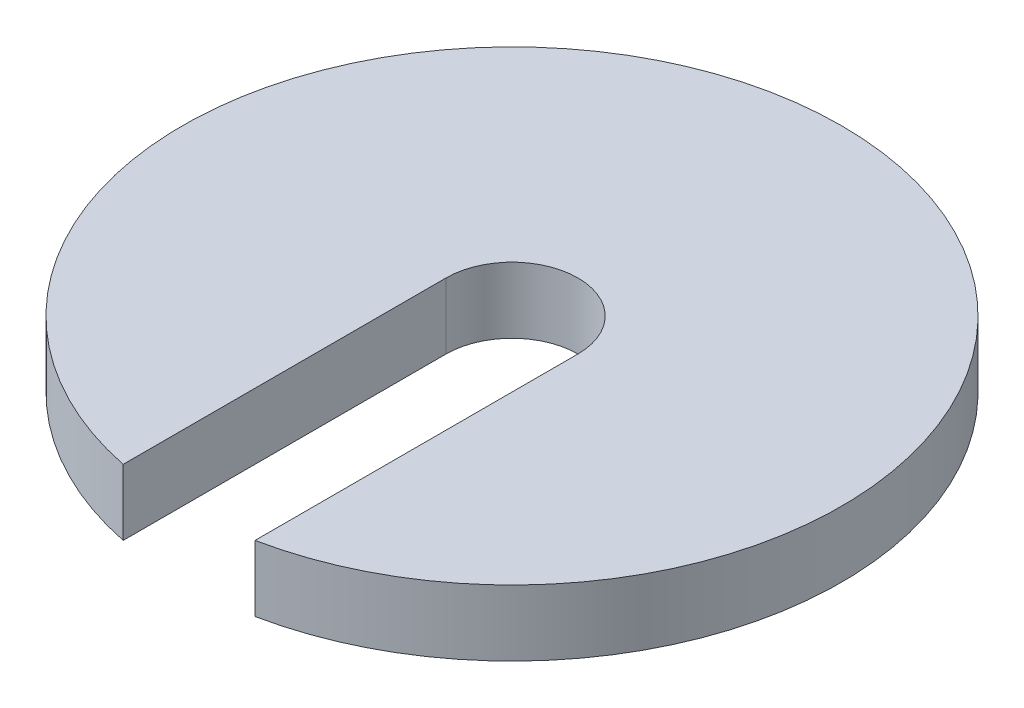
ISO-10303-21;
HEADER;
FILE_DESCRIPTION(('STEP AP214'),'2;1');
FILE_NAME('part.step','',(''),(''),'','','');
FILE_SCHEMA(('AUTOMOTIVE_DESIGN { 1 0 10303 214 1 1 1 1 }'));
ENDSEC;
DATA;
#1=APPLICATION_CONTEXT('core data for automotive mechanical design processes');
#2=APPLICATION_PROTOCOL_DEFINITION('international standard','automotive_design',2000,#1);
#3=PRODUCT_CONTEXT('',#1,'mechanical');
#4=PRODUCT('Part','Part','',(#3));
#5=PRODUCT_RELATED_PRODUCT_CATEGORY('part','',(#4));
#6=PRODUCT_DEFINITION_FORMATION('','',#4);
#7=PRODUCT_DEFINITION_CONTEXT('part definition',#1,'design');
#8=PRODUCT_DEFINITION('design','',#6,#7);
#9=PRODUCT_DEFINITION_SHAPE('','',#8);
#10=(LENGTH_UNIT() NAMED_UNIT(*) SI_UNIT(.MILLI.,.METRE.));
#11=(NAMED_UNIT(*) PLANE_ANGLE_UNIT() SI_UNIT($,.RADIAN.));
#12=(NAMED_UNIT(*) SI_UNIT($,.STERADIAN.) SOLID_ANGLE_UNIT());
#13=UNCERTAINTY_MEASURE_WITH_UNIT(LENGTH_MEASURE(1.E-05),#10,'distance_accuracy_value','');
#14=(GEOMETRIC_REPRESENTATION_CONTEXT(3) GLOBAL_UNCERTAINTY_ASSIGNED_CONTEXT((#13)) GLOBAL_UNIT_ASSIGNED_CONTEXT((#10,
#11,#12)) REPRESENTATION_CONTEXT('',''));
#15=CARTESIAN_POINT('',(0.,0.,0.));
#16=DIRECTION('',(0.,0.,1.));
#17=DIRECTION('',(1.,0.,0.));
#18=AXIS2_PLACEMENT_3D('',#15,#16,#17);
#19=CARTESIAN_POINT('',(0.,15.,0.));
#20=DIRECTION('',(0.,-1.,0.));
#21=DIRECTION('',(0.,0.,-1.));
#22=AXIS2_PLACEMENT_3D('',#19,#20,#21);
#23=CYLINDRICAL_SURFACE('',#22,150.);
#24=CARTESIAN_POINT('',(0.,-15.,0.));
#25=DIRECTION('',(0.,1.,0.));
#26=DIRECTION('',(0.,0.,1.));
#27=AXIS2_PLACEMENT_3D('',#24,#25,#26);
#28=CIRCLE('',#27,150.);
#29=CARTESIAN_POINT('',(30.,-15.,146.969384566991));
#30=VERTEX_POINT('',#29);
#31=CARTESIAN_POINT('',(-30.,-15.,146.969384566991));
#32=VERTEX_POINT('',#31);
#33=EDGE_CURVE('E100',#30,#32,#28,.T.);
#34=ORIENTED_EDGE('',*,*,#33,.T.);
#35=DIRECTION('',(0.,-1.,0.));
#36=VECTOR('',#35,1.);
#37=CARTESIAN_POINT('',(-30.,15.,146.969384566991));
#38=LINE('',#37,#36);
#39=CARTESIAN_POINT('',(-30.,15.,146.969384566991));
#40=VERTEX_POINT('',#39);
#41=EDGE_CURVE('E11',#40,#32,#38,.T.);
#42=ORIENTED_EDGE('',*,*,#41,.F.);
#43=CARTESIAN_POINT('',(0.,15.,0.));
#44=DIRECTION('',(0.,1.,0.));
#45=DIRECTION('',(0.,0.,1.));
#46=AXIS2_PLACEMENT_3D('',#43,#44,#45);
#47=CIRCLE('',#46,150.);
#48=CARTESIAN_POINT('',(30.,15.,146.969384566991));
#49=VERTEX_POINT('',#48);
#50=EDGE_CURVE('E88',#49,#40,#47,.T.);
#51=ORIENTED_EDGE('',*,*,#50,.F.);
#52=DIRECTION('',(0.,-1.,0.));
#53=VECTOR('',#52,1.);
#54=CARTESIAN_POINT('',(30.,15.,146.969384566991));
#55=LINE('',#54,#53);
#56=EDGE_CURVE('E96',#49,#30,#55,.T.);
#57=ORIENTED_EDGE('',*,*,#56,.T.);
#58=EDGE_LOOP('',(#34,#42,#51,#57));
#59=FACE_BOUND('',#58,.T.);
#60=ADVANCED_FACE('F37',(#59),#23,.T.);
#61=CARTESIAN_POINT('',(-30.,15.,146.969384566991));
#62=DIRECTION('',(-1.,0.,0.));
#63=DIRECTION('',(0.,0.,1.));
#64=AXIS2_PLACEMENT_3D('',#61,#62,#63);
#65=PLANE('',#64);
#66=DIRECTION('',(0.,0.,-1.));
#67=VECTOR('',#66,1.);
#68=CARTESIAN_POINT('',(-30.,-15.,146.969384566991));
#69=LINE('',#68,#67);
#70=CARTESIAN_POINT('',(-30.,-15.,0.));
#71=VERTEX_POINT('',#70);
#72=EDGE_CURVE('E92',#32,#71,#69,.T.);
#73=ORIENTED_EDGE('',*,*,#72,.T.);
#74=DIRECTION('',(0.,-1.,0.));
#75=VECTOR('',#74,1.);
#76=CARTESIAN_POINT('',(-30.,15.,0.));
#77=LINE('',#76,#75);
#78=CARTESIAN_POINT('',(-30.,15.,0.));
#79=VERTEX_POINT('',#78);
#80=EDGE_CURVE('E45',#79,#71,#77,.T.);
#81=ORIENTED_EDGE('',*,*,#80,.F.);
#82=DIRECTION('',(0.,0.,-1.));
#83=VECTOR('',#82,1.);
#84=CARTESIAN_POINT('',(-30.,15.,146.969384566991));
#85=LINE('',#84,#83);
#86=EDGE_CURVE('E83',#40,#79,#85,.T.);
#87=ORIENTED_EDGE('',*,*,#86,.F.);
#88=ORIENTED_EDGE('',*,*,#41,.T.);
#89=EDGE_LOOP('',(#73,#81,#87,#88));
#90=FACE_BOUND('',#89,.T.);
#91=ADVANCED_FACE('F91',(#90),#65,.F.);
#92=CARTESIAN_POINT('',(0.,15.,0.));
#93=DIRECTION('',(0.,-1.,0.));
#94=DIRECTION('',(0.,0.,-1.));
#95=AXIS2_PLACEMENT_3D('',#92,#93,#94);
#96=CYLINDRICAL_SURFACE('',#95,30.);
#97=CARTESIAN_POINT('',(0.,-15.,0.));
#98=DIRECTION('',(0.,-1.,0.));
#99=DIRECTION('',(0.,0.,1.));
#100=AXIS2_PLACEMENT_3D('',#97,#98,#99);
#101=CIRCLE('',#100,30.);
#102=CARTESIAN_POINT('',(30.,-15.,0.));
#103=VERTEX_POINT('',#102);
#104=EDGE_CURVE('E70',#71,#103,#101,.T.);
#105=ORIENTED_EDGE('',*,*,#104,.T.);
#106=DIRECTION('',(0.,-1.,0.));
#107=VECTOR('',#106,1.);
#108=CARTESIAN_POINT('',(30.,15.,0.));
#109=LINE('',#108,#107);
#110=CARTESIAN_POINT('',(30.,15.,0.));
#111=VERTEX_POINT('',#110);
#112=EDGE_CURVE('E93',#111,#103,#109,.T.);
#113=ORIENTED_EDGE('',*,*,#112,.F.);
#114=CARTESIAN_POINT('',(0.,15.,0.));
#115=DIRECTION('',(0.,-1.,0.));
#116=DIRECTION('',(0.,0.,1.));
#117=AXIS2_PLACEMENT_3D('',#114,#115,#116);
#118=CIRCLE('',#117,30.);
#119=EDGE_CURVE('E86',#79,#111,#118,.T.);
#120=ORIENTED_EDGE('',*,*,#119,.F.);
#121=ORIENTED_EDGE('',*,*,#80,.T.);
#122=EDGE_LOOP('',(#105,#113,#120,#121));
#123=FACE_BOUND('',#122,.T.);
#124=ADVANCED_FACE('F94',(#123),#96,.F.);
#125=CARTESIAN_POINT('',(30.,15.,0.));
#126=DIRECTION('',(1.,0.,0.));
#127=DIRECTION('',(0.,0.,-1.));
#128=AXIS2_PLACEMENT_3D('',#125,#126,#127);
#129=PLANE('',#128);
#130=DIRECTION('',(0.,0.,1.));
#131=VECTOR('',#130,1.);
#132=CARTESIAN_POINT('',(30.,-15.,0.));
#133=LINE('',#132,#131);
#134=EDGE_CURVE('E76',#103,#30,#133,.T.);
#135=ORIENTED_EDGE('',*,*,#134,.T.);
#136=ORIENTED_EDGE('',*,*,#56,.F.);
#137=DIRECTION('',(0.,0.,1.));
#138=VECTOR('',#137,1.);
#139=CARTESIAN_POINT('',(30.,15.,0.));
#140=LINE('',#139,#138);
#141=EDGE_CURVE('E53',#111,#49,#140,.T.);
#142=ORIENTED_EDGE('',*,*,#141,.F.);
#143=ORIENTED_EDGE('',*,*,#112,.T.);
#144=EDGE_LOOP('',(#135,#136,#142,#143));
#145=FACE_BOUND('',#144,.T.);
#146=ADVANCED_FACE('F107',(#145),#129,.F.);
#147=CARTESIAN_POINT('',(0.,15.,0.));
#148=DIRECTION('',(0.,1.,0.));
#149=DIRECTION('',(0.,0.,1.));
#150=AXIS2_PLACEMENT_3D('',#147,#148,#149);
#151=PLANE('',#150);
#152=ORIENTED_EDGE('',*,*,#50,.T.);
#153=ORIENTED_EDGE('',*,*,#86,.T.);
#154=ORIENTED_EDGE('',*,*,#119,.T.);
#155=ORIENTED_EDGE('',*,*,#141,.T.);
#156=EDGE_LOOP('',(#152,#153,#154,#155));
#157=FACE_BOUND('',#156,.T.);
#158=ADVANCED_FACE('F84',(#157),#151,.T.);
#159=CARTESIAN_POINT('',(0.,-15.,0.));
#160=DIRECTION('',(0.,1.,0.));
#161=DIRECTION('',(0.,0.,1.));
#162=AXIS2_PLACEMENT_3D('',#159,#160,#161);
#163=PLANE('',#162);
#164=ORIENTED_EDGE('',*,*,#33,.F.);
#165=ORIENTED_EDGE('',*,*,#134,.F.);
#166=ORIENTED_EDGE('',*,*,#104,.F.);
#167=ORIENTED_EDGE('',*,*,#72,.F.);
#168=EDGE_LOOP('',(#164,#165,#166,#167));
#169=FACE_BOUND('',#168,.T.);
#170=ADVANCED_FACE('F110',(#169),#163,.F.);
#171=CLOSED_SHELL('',(#60,#91,#124,#146,#158,#170));
#172=MANIFOLD_SOLID_BREP('B2',#171);
#173=ADVANCED_BREP_SHAPE_REPRESENTATION('',(#18,#172),#14);
#174=SHAPE_DEFINITION_REPRESENTATION(#9,#173);
ENDSEC;
END-ISO-10303-21;
